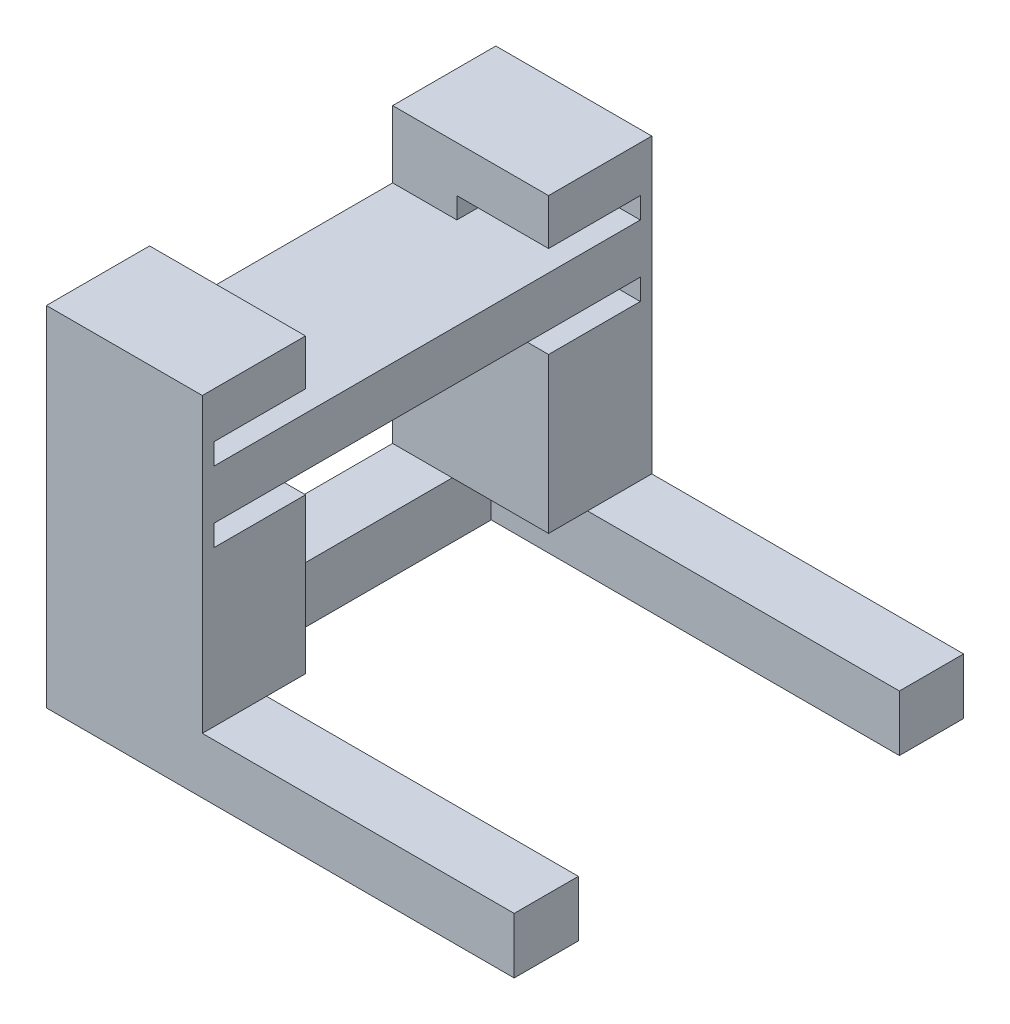
ISO-10303-21;
HEADER;
FILE_DESCRIPTION(('STEP AP214'),'2;1');
FILE_NAME('part.step','',(''),(''),'','','');
FILE_SCHEMA(('AUTOMOTIVE_DESIGN { 1 0 10303 214 1 1 1 1 }'));
ENDSEC;
DATA;
#1=APPLICATION_CONTEXT('core data for automotive mechanical design processes');
#2=APPLICATION_PROTOCOL_DEFINITION('international standard','automotive_design',2000,#1);
#3=PRODUCT_CONTEXT('',#1,'mechanical');
#4=PRODUCT('Part','Part','',(#3));
#5=PRODUCT_RELATED_PRODUCT_CATEGORY('part','',(#4));
#6=PRODUCT_DEFINITION_FORMATION('','',#4);
#7=PRODUCT_DEFINITION_CONTEXT('part definition',#1,'design');
#8=PRODUCT_DEFINITION('design','',#6,#7);
#9=PRODUCT_DEFINITION_SHAPE('','',#8);
#10=(LENGTH_UNIT() NAMED_UNIT(*) SI_UNIT(.MILLI.,.METRE.));
#11=(NAMED_UNIT(*) PLANE_ANGLE_UNIT() SI_UNIT($,.RADIAN.));
#12=(NAMED_UNIT(*) SI_UNIT($,.STERADIAN.) SOLID_ANGLE_UNIT());
#13=UNCERTAINTY_MEASURE_WITH_UNIT(LENGTH_MEASURE(1.E-05),#10,'distance_accuracy_value','');
#14=(GEOMETRIC_REPRESENTATION_CONTEXT(3) GLOBAL_UNCERTAINTY_ASSIGNED_CONTEXT((#13)) GLOBAL_UNIT_ASSIGNED_CONTEXT((#10,
#11,#12)) REPRESENTATION_CONTEXT('',''));
#15=CARTESIAN_POINT('',(0.,0.,0.));
#16=DIRECTION('',(0.,0.,1.));
#17=DIRECTION('',(1.,0.,0.));
#18=AXIS2_PLACEMENT_3D('',#15,#16,#17);
#19=CARTESIAN_POINT('',(17.,0.,0.));
#20=DIRECTION('',(1.,0.,0.));
#21=DIRECTION('',(0.,0.,-1.));
#22=AXIS2_PLACEMENT_3D('',#19,#20,#21);
#23=PLANE('',#22);
#24=DIRECTION('',(0.,0.,-1.));
#25=VECTOR('',#24,1.);
#26=CARTESIAN_POINT('',(17.,0.,0.));
#27=LINE('',#26,#25);
#28=CARTESIAN_POINT('',(17.,0.,-17.5));
#29=VERTEX_POINT('',#28);
#30=CARTESIAN_POINT('',(17.,0.,-24.5));
#31=VERTEX_POINT('',#30);
#32=EDGE_CURVE('E293',#29,#31,#27,.T.);
#33=ORIENTED_EDGE('',*,*,#32,.T.);
#34=DIRECTION('',(0.,1.,0.));
#35=VECTOR('',#34,1.);
#36=CARTESIAN_POINT('',(17.,6.1,-24.5));
#37=LINE('',#36,#35);
#38=CARTESIAN_POINT('',(17.,6.1,-24.5));
#39=VERTEX_POINT('',#38);
#40=EDGE_CURVE('E297',#31,#39,#37,.T.);
#41=ORIENTED_EDGE('',*,*,#40,.T.);
#42=DIRECTION('',(0.,0.,1.));
#43=VECTOR('',#42,1.);
#44=CARTESIAN_POINT('',(17.,6.1,0.));
#45=LINE('',#44,#43);
#46=CARTESIAN_POINT('',(17.,6.09999999999999,-17.5));
#47=VERTEX_POINT('',#46);
#48=EDGE_CURVE('E263',#39,#47,#45,.T.);
#49=ORIENTED_EDGE('',*,*,#48,.T.);
#50=DIRECTION('',(0.,-1.,0.));
#51=VECTOR('',#50,1.);
#52=CARTESIAN_POINT('',(17.,71.2920240520265,-17.5));
#53=LINE('',#52,#51);
#54=EDGE_CURVE('E257',#47,#29,#53,.T.);
#55=ORIENTED_EDGE('',*,*,#54,.T.);
#56=EDGE_LOOP('',(#33,#41,#49,#55));
#57=FACE_BOUND('',#56,.T.);
#58=ADVANCED_FACE('F32',(#57),#23,.T.);
#59=DIRECTION('',(0.,0.,1.));
#60=VECTOR('',#59,1.);
#61=CARTESIAN_POINT('',(17.,6.1,0.));
#62=LINE('',#61,#60);
#63=CARTESIAN_POINT('',(17.,6.09999999999999,17.5));
#64=VERTEX_POINT('',#63);
#65=CARTESIAN_POINT('',(17.,6.1,24.5));
#66=VERTEX_POINT('',#65);
#67=EDGE_CURVE('E254',#64,#66,#62,.T.);
#68=ORIENTED_EDGE('',*,*,#67,.T.);
#69=DIRECTION('',(0.,-1.,0.));
#70=VECTOR('',#69,1.);
#71=CARTESIAN_POINT('',(17.,6.1,24.5));
#72=LINE('',#71,#70);
#73=CARTESIAN_POINT('',(17.,0.,24.5));
#74=VERTEX_POINT('',#73);
#75=EDGE_CURVE('E299',#66,#74,#72,.T.);
#76=ORIENTED_EDGE('',*,*,#75,.T.);
#77=CARTESIAN_POINT('',(17.,0.,17.5));
#78=VERTEX_POINT('',#77);
#79=EDGE_CURVE('E256',#74,#78,#27,.T.);
#80=ORIENTED_EDGE('',*,*,#79,.T.);
#81=DIRECTION('',(0.,1.,0.));
#82=VECTOR('',#81,1.);
#83=CARTESIAN_POINT('',(17.,71.2920240520265,17.5));
#84=LINE('',#83,#82);
#85=EDGE_CURVE('E241',#78,#64,#84,.T.);
#86=ORIENTED_EDGE('',*,*,#85,.T.);
#87=EDGE_LOOP('',(#68,#76,#80,#86));
#88=FACE_BOUND('',#87,.T.);
#89=ADVANCED_FACE('F252',(#88),#23,.T.);
#90=CARTESIAN_POINT('',(-27.,0.,0.));
#91=DIRECTION('',(1.,0.,0.));
#92=DIRECTION('',(0.,0.,-1.));
#93=AXIS2_PLACEMENT_3D('',#90,#91,#92);
#94=PLANE('',#93);
#95=DIRECTION('',(0.,0.,1.));
#96=VECTOR('',#95,1.);
#97=CARTESIAN_POINT('',(-27.,30.7,0.));
#98=LINE('',#97,#96);
#99=CARTESIAN_POINT('',(-27.,30.7,13.25));
#100=VERTEX_POINT('',#99);
#101=CARTESIAN_POINT('',(-27.,30.7,23.25));
#102=VERTEX_POINT('',#101);
#103=EDGE_CURVE('E446',#100,#102,#98,.T.);
#104=ORIENTED_EDGE('',*,*,#103,.F.);
#105=DIRECTION('',(0.,1.,0.));
#106=VECTOR('',#105,1.);
#107=CARTESIAN_POINT('',(-27.,0.,13.25));
#108=LINE('',#107,#106);
#109=CARTESIAN_POINT('',(-27.,33.,13.25));
#110=VERTEX_POINT('',#109);
#111=EDGE_CURVE('E406',#100,#110,#108,.T.);
#112=ORIENTED_EDGE('',*,*,#111,.T.);
#113=DIRECTION('',(0.,0.,-1.));
#114=VECTOR('',#113,1.);
#115=CARTESIAN_POINT('',(-27.,33.,-23.25));
#116=LINE('',#115,#114);
#117=CARTESIAN_POINT('',(-27.,33.,23.25));
#118=VERTEX_POINT('',#117);
#119=EDGE_CURVE('E383',#118,#110,#116,.T.);
#120=ORIENTED_EDGE('',*,*,#119,.F.);
#121=DIRECTION('',(0.,1.,0.));
#122=VECTOR('',#121,1.);
#123=CARTESIAN_POINT('',(-27.,23.,23.25));
#124=LINE('',#123,#122);
#125=EDGE_CURVE('E379',#102,#118,#124,.T.);
#126=ORIENTED_EDGE('',*,*,#125,.F.);
#127=EDGE_LOOP('',(#104,#112,#120,#126));
#128=FACE_BOUND('',#127,.T.);
#129=ADVANCED_FACE('F571',(#128),#94,.T.);
#130=CARTESIAN_POINT('',(-27.,0.,0.));
#131=DIRECTION('',(1.,0.,0.));
#132=DIRECTION('',(0.,0.,-1.));
#133=AXIS2_PLACEMENT_3D('',#130,#131,#132);
#134=PLANE('',#133);
#135=DIRECTION('',(0.,0.,1.));
#136=VECTOR('',#135,1.);
#137=CARTESIAN_POINT('',(-27.,30.7,0.));
#138=LINE('',#137,#136);
#139=CARTESIAN_POINT('',(-27.,30.7,-23.25));
#140=VERTEX_POINT('',#139);
#141=CARTESIAN_POINT('',(-27.,30.7,-13.25));
#142=VERTEX_POINT('',#141);
#143=EDGE_CURVE('E453',#140,#142,#138,.T.);
#144=ORIENTED_EDGE('',*,*,#143,.F.);
#145=DIRECTION('',(0.,-1.,0.));
#146=VECTOR('',#145,1.);
#147=CARTESIAN_POINT('',(-27.,23.,-23.25));
#148=LINE('',#147,#146);
#149=CARTESIAN_POINT('',(-27.,33.,-23.25));
#150=VERTEX_POINT('',#149);
#151=EDGE_CURVE('E412',#150,#140,#148,.T.);
#152=ORIENTED_EDGE('',*,*,#151,.F.);
#153=DIRECTION('',(0.,0.,-1.));
#154=VECTOR('',#153,1.);
#155=CARTESIAN_POINT('',(-27.,33.,-23.25));
#156=LINE('',#155,#154);
#157=CARTESIAN_POINT('',(-27.,33.,-13.25));
#158=VERTEX_POINT('',#157);
#159=EDGE_CURVE('E414',#158,#150,#156,.T.);
#160=ORIENTED_EDGE('',*,*,#159,.F.);
#161=DIRECTION('',(0.,-1.,0.));
#162=VECTOR('',#161,1.);
#163=CARTESIAN_POINT('',(-27.,0.,-13.25));
#164=LINE('',#163,#162);
#165=EDGE_CURVE('E417',#158,#142,#164,.T.);
#166=ORIENTED_EDGE('',*,*,#165,.T.);
#167=EDGE_LOOP('',(#144,#152,#160,#166));
#168=FACE_BOUND('',#167,.T.);
#169=ADVANCED_FACE('F530',(#168),#134,.T.);
#170=DIRECTION('',(0.,0.,-1.));
#171=VECTOR('',#170,1.);
#172=CARTESIAN_POINT('',(-27.,25.3,0.));
#173=LINE('',#172,#171);
#174=CARTESIAN_POINT('',(-27.,25.3,-13.25));
#175=VERTEX_POINT('',#174);
#176=CARTESIAN_POINT('',(-27.,25.3,-23.25));
#177=VERTEX_POINT('',#176);
#178=EDGE_CURVE('E464',#175,#177,#173,.T.);
#179=ORIENTED_EDGE('',*,*,#178,.F.);
#180=CARTESIAN_POINT('',(-27.,23.,-13.25));
#181=VERTEX_POINT('',#180);
#182=EDGE_CURVE('E441',#175,#181,#164,.T.);
#183=ORIENTED_EDGE('',*,*,#182,.T.);
#184=DIRECTION('',(0.,0.,1.));
#185=VECTOR('',#184,1.);
#186=CARTESIAN_POINT('',(-27.,23.,-23.25));
#187=LINE('',#186,#185);
#188=CARTESIAN_POINT('',(-27.,23.,-23.25));
#189=VERTEX_POINT('',#188);
#190=EDGE_CURVE('E409',#189,#181,#187,.T.);
#191=ORIENTED_EDGE('',*,*,#190,.F.);
#192=EDGE_CURVE('E418',#177,#189,#148,.T.);
#193=ORIENTED_EDGE('',*,*,#192,.F.);
#194=EDGE_LOOP('',(#179,#183,#191,#193));
#195=FACE_BOUND('',#194,.T.);
#196=ADVANCED_FACE('F597',(#195),#134,.T.);
#197=DIRECTION('',(0.,0.,-1.));
#198=VECTOR('',#197,1.);
#199=CARTESIAN_POINT('',(-27.,25.3,0.));
#200=LINE('',#199,#198);
#201=CARTESIAN_POINT('',(-27.,25.3,23.25));
#202=VERTEX_POINT('',#201);
#203=CARTESIAN_POINT('',(-27.,25.3,13.25));
#204=VERTEX_POINT('',#203);
#205=EDGE_CURVE('E457',#202,#204,#200,.T.);
#206=ORIENTED_EDGE('',*,*,#205,.F.);
#207=CARTESIAN_POINT('',(-27.,23.,23.25));
#208=VERTEX_POINT('',#207);
#209=EDGE_CURVE('E395',#208,#202,#124,.T.);
#210=ORIENTED_EDGE('',*,*,#209,.F.);
#211=DIRECTION('',(0.,0.,1.));
#212=VECTOR('',#211,1.);
#213=CARTESIAN_POINT('',(-27.,23.,-23.25));
#214=LINE('',#213,#212);
#215=CARTESIAN_POINT('',(-27.,23.,13.25));
#216=VERTEX_POINT('',#215);
#217=EDGE_CURVE('E375',#216,#208,#214,.T.);
#218=ORIENTED_EDGE('',*,*,#217,.F.);
#219=EDGE_CURVE('E378',#216,#204,#108,.T.);
#220=ORIENTED_EDGE('',*,*,#219,.T.);
#221=EDGE_LOOP('',(#206,#210,#218,#220));
#222=FACE_BOUND('',#221,.T.);
#223=ADVANCED_FACE('F592',(#222),#94,.T.);
#224=CARTESIAN_POINT('',(34.001,23.,-23.25));
#225=DIRECTION('',(0.,-1.,0.));
#226=DIRECTION('',(0.,0.,-1.));
#227=AXIS2_PLACEMENT_3D('',#224,#225,#226);
#228=PLANE('',#227);
#229=DIRECTION('',(1.,0.,0.));
#230=VECTOR('',#229,1.);
#231=CARTESIAN_POINT('',(34.001,23.,13.25));
#232=LINE('',#231,#230);
#233=CARTESIAN_POINT('',(-17.,23.,13.25));
#234=VERTEX_POINT('',#233);
#235=EDGE_CURVE('E380',#216,#234,#232,.T.);
#236=ORIENTED_EDGE('',*,*,#235,.F.);
#237=ORIENTED_EDGE('',*,*,#217,.T.);
#238=DIRECTION('',(-1.,0.,0.));
#239=VECTOR('',#238,1.);
#240=CARTESIAN_POINT('',(34.001,23.,23.25));
#241=LINE('',#240,#239);
#242=CARTESIAN_POINT('',(-17.,23.,23.25));
#243=VERTEX_POINT('',#242);
#244=EDGE_CURVE('E402',#243,#208,#241,.T.);
#245=ORIENTED_EDGE('',*,*,#244,.F.);
#246=DIRECTION('',(0.,0.,1.));
#247=VECTOR('',#246,1.);
#248=CARTESIAN_POINT('',(-17.,23.,-23.25));
#249=LINE('',#248,#247);
#250=EDGE_CURVE('E384',#234,#243,#249,.T.);
#251=ORIENTED_EDGE('',*,*,#250,.F.);
#252=EDGE_LOOP('',(#236,#237,#245,#251));
#253=FACE_BOUND('',#252,.T.);
#254=ADVANCED_FACE('F587',(#253),#228,.F.);
#255=CARTESIAN_POINT('',(-34.,38.,13.25));
#256=DIRECTION('',(0.,0.,-1.));
#257=DIRECTION('',(-1.,0.,0.));
#258=AXIS2_PLACEMENT_3D('',#255,#256,#257);
#259=PLANE('',#258);
#260=DIRECTION('',(1.,0.,0.));
#261=VECTOR('',#260,1.);
#262=CARTESIAN_POINT('',(-34.,30.7,13.25));
#263=LINE('',#262,#261);
#264=CARTESIAN_POINT('',(-34.,30.7,13.25));
#265=VERTEX_POINT('',#264);
#266=EDGE_CURVE('E444',#265,#100,#263,.T.);
#267=ORIENTED_EDGE('',*,*,#266,.F.);
#268=DIRECTION('',(0.,-1.,0.));
#269=VECTOR('',#268,1.);
#270=CARTESIAN_POINT('',(-34.,38.,13.25));
#271=LINE('',#270,#269);
#272=CARTESIAN_POINT('',(-34.,38.,13.25));
#273=VERTEX_POINT('',#272);
#274=EDGE_CURVE('E324',#273,#265,#271,.T.);
#275=ORIENTED_EDGE('',*,*,#274,.F.);
#276=DIRECTION('',(1.,0.,0.));
#277=VECTOR('',#276,1.);
#278=CARTESIAN_POINT('',(-34.,38.,13.25));
#279=LINE('',#278,#277);
#280=CARTESIAN_POINT('',(-17.,38.,13.25));
#281=VERTEX_POINT('',#280);
#282=EDGE_CURVE('E340',#273,#281,#279,.T.);
#283=ORIENTED_EDGE('',*,*,#282,.T.);
#284=DIRECTION('',(0.,-1.,0.));
#285=VECTOR('',#284,1.);
#286=CARTESIAN_POINT('',(-17.,38.,13.25));
#287=LINE('',#286,#285);
#288=CARTESIAN_POINT('',(-17.,33.,13.25));
#289=VERTEX_POINT('',#288);
#290=EDGE_CURVE('E329',#281,#289,#287,.T.);
#291=ORIENTED_EDGE('',*,*,#290,.T.);
#292=DIRECTION('',(-1.,0.,0.));
#293=VECTOR('',#292,1.);
#294=CARTESIAN_POINT('',(34.001,33.,13.25));
#295=LINE('',#294,#293);
#296=EDGE_CURVE('E374',#289,#110,#295,.T.);
#297=ORIENTED_EDGE('',*,*,#296,.T.);
#298=ORIENTED_EDGE('',*,*,#111,.F.);
#299=EDGE_LOOP('',(#267,#275,#283,#291,#297,#298));
#300=FACE_BOUND('',#299,.T.);
#301=ADVANCED_FACE('F566',(#300),#259,.T.);
#302=CARTESIAN_POINT('',(34.001,33.,-23.25));
#303=DIRECTION('',(0.,1.,0.));
#304=DIRECTION('',(0.,0.,1.));
#305=AXIS2_PLACEMENT_3D('',#302,#303,#304);
#306=PLANE('',#305);
#307=DIRECTION('',(-1.,0.,0.));
#308=VECTOR('',#307,1.);
#309=CARTESIAN_POINT('',(34.001,33.,23.25));
#310=LINE('',#309,#308);
#311=CARTESIAN_POINT('',(-17.,33.,23.25));
#312=VERTEX_POINT('',#311);
#313=EDGE_CURVE('E392',#312,#118,#310,.T.);
#314=ORIENTED_EDGE('',*,*,#313,.T.);
#315=ORIENTED_EDGE('',*,*,#119,.T.);
#316=ORIENTED_EDGE('',*,*,#296,.F.);
#317=DIRECTION('',(0.,0.,-1.));
#318=VECTOR('',#317,1.);
#319=CARTESIAN_POINT('',(-17.,33.,-23.25));
#320=LINE('',#319,#318);
#321=EDGE_CURVE('E387',#312,#289,#320,.T.);
#322=ORIENTED_EDGE('',*,*,#321,.F.);
#323=EDGE_LOOP('',(#314,#315,#316,#322));
#324=FACE_BOUND('',#323,.T.);
#325=ADVANCED_FACE('F578',(#324),#306,.F.);
#326=CARTESIAN_POINT('',(34.001,23.,23.25));
#327=DIRECTION('',(0.,0.,1.));
#328=DIRECTION('',(1.,0.,0.));
#329=AXIS2_PLACEMENT_3D('',#326,#327,#328);
#330=PLANE('',#329);
#331=DIRECTION('',(0.,1.,0.));
#332=VECTOR('',#331,1.);
#333=CARTESIAN_POINT('',(-17.,23.,23.25));
#334=LINE('',#333,#332);
#335=CARTESIAN_POINT('',(-17.,30.7,23.25));
#336=VERTEX_POINT('',#335);
#337=EDGE_CURVE('E391',#336,#312,#334,.T.);
#338=ORIENTED_EDGE('',*,*,#337,.F.);
#339=DIRECTION('',(-1.,0.,0.));
#340=VECTOR('',#339,1.);
#341=CARTESIAN_POINT('',(34.001,30.7,23.25));
#342=LINE('',#341,#340);
#343=EDGE_CURVE('E448',#336,#102,#342,.T.);
#344=ORIENTED_EDGE('',*,*,#343,.T.);
#345=ORIENTED_EDGE('',*,*,#125,.T.);
#346=ORIENTED_EDGE('',*,*,#313,.F.);
#347=EDGE_LOOP('',(#338,#344,#345,#346));
#348=FACE_BOUND('',#347,.T.);
#349=ADVANCED_FACE('F575',(#348),#330,.F.);
#350=CARTESIAN_POINT('',(32.2966530304036,30.7,24.5));
#351=DIRECTION('',(0.,1.,0.));
#352=DIRECTION('',(0.,0.,1.));
#353=AXIS2_PLACEMENT_3D('',#350,#351,#352);
#354=PLANE('',#353);
#355=DIRECTION('',(0.,0.,-1.));
#356=VECTOR('',#355,1.);
#357=CARTESIAN_POINT('',(-34.,30.7,24.5));
#358=LINE('',#357,#356);
#359=CARTESIAN_POINT('',(-34.,30.7,-13.25));
#360=VERTEX_POINT('',#359);
#361=EDGE_CURVE('E471',#265,#360,#358,.T.);
#362=ORIENTED_EDGE('',*,*,#361,.F.);
#363=ORIENTED_EDGE('',*,*,#266,.T.);
#364=ORIENTED_EDGE('',*,*,#103,.T.);
#365=ORIENTED_EDGE('',*,*,#343,.F.);
#366=DIRECTION('',(0.,0.,-1.));
#367=VECTOR('',#366,1.);
#368=CARTESIAN_POINT('',(-17.,30.7,24.5));
#369=LINE('',#368,#367);
#370=CARTESIAN_POINT('',(-17.,30.7,-23.25));
#371=VERTEX_POINT('',#370);
#372=EDGE_CURVE('E468',#336,#371,#369,.T.);
#373=ORIENTED_EDGE('',*,*,#372,.T.);
#374=DIRECTION('',(1.,0.,0.));
#375=VECTOR('',#374,1.);
#376=CARTESIAN_POINT('',(34.001,30.7,-23.25));
#377=LINE('',#376,#375);
#378=EDGE_CURVE('E301',#140,#371,#377,.T.);
#379=ORIENTED_EDGE('',*,*,#378,.F.);
#380=ORIENTED_EDGE('',*,*,#143,.T.);
#381=DIRECTION('',(-1.,0.,0.));
#382=VECTOR('',#381,1.);
#383=CARTESIAN_POINT('',(-34.,30.7,-13.25));
#384=LINE('',#383,#382);
#385=EDGE_CURVE('E451',#142,#360,#384,.T.);
#386=ORIENTED_EDGE('',*,*,#385,.T.);
#387=EDGE_LOOP('',(#362,#363,#364,#365,#373,#379,#380,#386));
#388=FACE_BOUND('',#387,.T.);
#389=ADVANCED_FACE('F531',(#388),#354,.T.);
#390=CARTESIAN_POINT('',(34.001,23.,-23.25));
#391=DIRECTION('',(0.,0.,-1.));
#392=DIRECTION('',(-1.,0.,0.));
#393=AXIS2_PLACEMENT_3D('',#390,#391,#392);
#394=PLANE('',#393);
#395=ORIENTED_EDGE('',*,*,#151,.T.);
#396=ORIENTED_EDGE('',*,*,#378,.T.);
#397=DIRECTION('',(0.,-1.,0.));
#398=VECTOR('',#397,1.);
#399=CARTESIAN_POINT('',(-17.,23.,-23.25));
#400=LINE('',#399,#398);
#401=CARTESIAN_POINT('',(-17.,33.,-23.25));
#402=VERTEX_POINT('',#401);
#403=EDGE_CURVE('E422',#402,#371,#400,.T.);
#404=ORIENTED_EDGE('',*,*,#403,.F.);
#405=DIRECTION('',(-1.,0.,0.));
#406=VECTOR('',#405,1.);
#407=CARTESIAN_POINT('',(34.001,33.,-23.25));
#408=LINE('',#407,#406);
#409=EDGE_CURVE('E423',#402,#150,#408,.T.);
#410=ORIENTED_EDGE('',*,*,#409,.T.);
#411=EDGE_LOOP('',(#395,#396,#404,#410));
#412=FACE_BOUND('',#411,.T.);
#413=ADVANCED_FACE('F514',(#412),#394,.F.);
#414=CARTESIAN_POINT('',(34.001,33.,-23.25));
#415=DIRECTION('',(0.,1.,0.));
#416=DIRECTION('',(0.,0.,1.));
#417=AXIS2_PLACEMENT_3D('',#414,#415,#416);
#418=PLANE('',#417);
#419=ORIENTED_EDGE('',*,*,#159,.T.);
#420=ORIENTED_EDGE('',*,*,#409,.F.);
#421=DIRECTION('',(0.,0.,-1.));
#422=VECTOR('',#421,1.);
#423=CARTESIAN_POINT('',(-17.,33.,-23.25));
#424=LINE('',#423,#422);
#425=CARTESIAN_POINT('',(-17.,33.,-13.25));
#426=VERTEX_POINT('',#425);
#427=EDGE_CURVE('E425',#426,#402,#424,.T.);
#428=ORIENTED_EDGE('',*,*,#427,.F.);
#429=DIRECTION('',(1.,0.,0.));
#430=VECTOR('',#429,1.);
#431=CARTESIAN_POINT('',(34.001,33.,-13.25));
#432=LINE('',#431,#430);
#433=EDGE_CURVE('E430',#158,#426,#432,.T.);
#434=ORIENTED_EDGE('',*,*,#433,.F.);
#435=EDGE_LOOP('',(#419,#420,#428,#434));
#436=FACE_BOUND('',#435,.T.);
#437=ADVANCED_FACE('F524',(#436),#418,.F.);
#438=CARTESIAN_POINT('',(-34.,38.,-13.25));
#439=DIRECTION('',(0.,0.,1.));
#440=DIRECTION('',(1.,0.,0.));
#441=AXIS2_PLACEMENT_3D('',#438,#439,#440);
#442=PLANE('',#441);
#443=ORIENTED_EDGE('',*,*,#385,.F.);
#444=ORIENTED_EDGE('',*,*,#165,.F.);
#445=ORIENTED_EDGE('',*,*,#433,.T.);
#446=DIRECTION('',(0.,-1.,0.));
#447=VECTOR('',#446,1.);
#448=CARTESIAN_POINT('',(-17.,38.,-13.25));
#449=LINE('',#448,#447);
#450=CARTESIAN_POINT('',(-17.,38.,-13.25));
#451=VERTEX_POINT('',#450);
#452=EDGE_CURVE('E356',#451,#426,#449,.T.);
#453=ORIENTED_EDGE('',*,*,#452,.F.);
#454=DIRECTION('',(-1.,0.,0.));
#455=VECTOR('',#454,1.);
#456=CARTESIAN_POINT('',(-34.,38.,-13.25));
#457=LINE('',#456,#455);
#458=CARTESIAN_POINT('',(-34.,38.,-13.25));
#459=VERTEX_POINT('',#458);
#460=EDGE_CURVE('E354',#451,#459,#457,.T.);
#461=ORIENTED_EDGE('',*,*,#460,.T.);
#462=DIRECTION('',(0.,-1.,0.));
#463=VECTOR('',#462,1.);
#464=CARTESIAN_POINT('',(-34.,38.,-13.25));
#465=LINE('',#464,#463);
#466=EDGE_CURVE('E360',#459,#360,#465,.T.);
#467=ORIENTED_EDGE('',*,*,#466,.T.);
#468=EDGE_LOOP('',(#443,#444,#445,#453,#461,#467));
#469=FACE_BOUND('',#468,.T.);
#470=ADVANCED_FACE('F528',(#469),#442,.T.);
#471=CARTESIAN_POINT('',(34.001,23.,-23.25));
#472=DIRECTION('',(0.,-1.,0.));
#473=DIRECTION('',(0.,0.,-1.));
#474=AXIS2_PLACEMENT_3D('',#471,#472,#473);
#475=PLANE('',#474);
#476=DIRECTION('',(0.,0.,1.));
#477=VECTOR('',#476,1.);
#478=CARTESIAN_POINT('',(-17.,23.,-23.25));
#479=LINE('',#478,#477);
#480=CARTESIAN_POINT('',(-17.,23.,-23.25));
#481=VERTEX_POINT('',#480);
#482=CARTESIAN_POINT('',(-17.,23.,-13.25));
#483=VERTEX_POINT('',#482);
#484=EDGE_CURVE('E413',#481,#483,#479,.T.);
#485=ORIENTED_EDGE('',*,*,#484,.F.);
#486=DIRECTION('',(-1.,0.,0.));
#487=VECTOR('',#486,1.);
#488=CARTESIAN_POINT('',(34.001,23.,-23.25));
#489=LINE('',#488,#487);
#490=EDGE_CURVE('E419',#481,#189,#489,.T.);
#491=ORIENTED_EDGE('',*,*,#490,.T.);
#492=ORIENTED_EDGE('',*,*,#190,.T.);
#493=DIRECTION('',(-1.,0.,0.));
#494=VECTOR('',#493,1.);
#495=CARTESIAN_POINT('',(34.001,23.,-13.25));
#496=LINE('',#495,#494);
#497=EDGE_CURVE('E427',#483,#181,#496,.T.);
#498=ORIENTED_EDGE('',*,*,#497,.F.);
#499=EDGE_LOOP('',(#485,#491,#492,#498));
#500=FACE_BOUND('',#499,.T.);
#501=ADVANCED_FACE('F624',(#500),#475,.F.);
#502=CARTESIAN_POINT('',(-17.,25.3,-23.25));
#503=VERTEX_POINT('',#502);
#504=EDGE_CURVE('E426',#503,#481,#400,.T.);
#505=ORIENTED_EDGE('',*,*,#504,.F.);
#506=DIRECTION('',(-1.,0.,0.));
#507=VECTOR('',#506,1.);
#508=CARTESIAN_POINT('',(34.001,25.3,-23.25));
#509=LINE('',#508,#507);
#510=EDGE_CURVE('E506',#503,#177,#509,.T.);
#511=ORIENTED_EDGE('',*,*,#510,.T.);
#512=ORIENTED_EDGE('',*,*,#192,.T.);
#513=ORIENTED_EDGE('',*,*,#490,.F.);
#514=EDGE_LOOP('',(#505,#511,#512,#513));
#515=FACE_BOUND('',#514,.T.);
#516=ADVANCED_FACE('F620',(#515),#394,.F.);
#517=CARTESIAN_POINT('',(32.2966530304036,25.3,24.5));
#518=DIRECTION('',(0.,-1.,0.));
#519=DIRECTION('',(0.,0.,-1.));
#520=AXIS2_PLACEMENT_3D('',#517,#518,#519);
#521=PLANE('',#520);
#522=ORIENTED_EDGE('',*,*,#205,.T.);
#523=DIRECTION('',(-1.,0.,0.));
#524=VECTOR('',#523,1.);
#525=CARTESIAN_POINT('',(-34.,25.3,13.25));
#526=LINE('',#525,#524);
#527=CARTESIAN_POINT('',(-34.,25.3,13.25));
#528=VERTEX_POINT('',#527);
#529=EDGE_CURVE('E455',#204,#528,#526,.T.);
#530=ORIENTED_EDGE('',*,*,#529,.T.);
#531=DIRECTION('',(0.,0.,1.));
#532=VECTOR('',#531,1.);
#533=CARTESIAN_POINT('',(-34.,25.3,24.5));
#534=LINE('',#533,#532);
#535=CARTESIAN_POINT('',(-34.,25.3,-13.25));
#536=VERTEX_POINT('',#535);
#537=EDGE_CURVE('E470',#536,#528,#534,.T.);
#538=ORIENTED_EDGE('',*,*,#537,.F.);
#539=DIRECTION('',(1.,0.,0.));
#540=VECTOR('',#539,1.);
#541=CARTESIAN_POINT('',(-34.,25.3,-13.25));
#542=LINE('',#541,#540);
#543=EDGE_CURVE('E462',#536,#175,#542,.T.);
#544=ORIENTED_EDGE('',*,*,#543,.T.);
#545=ORIENTED_EDGE('',*,*,#178,.T.);
#546=ORIENTED_EDGE('',*,*,#510,.F.);
#547=DIRECTION('',(0.,0.,1.));
#548=VECTOR('',#547,1.);
#549=CARTESIAN_POINT('',(-17.,25.3,24.5));
#550=LINE('',#549,#548);
#551=CARTESIAN_POINT('',(-17.,25.3,23.25));
#552=VERTEX_POINT('',#551);
#553=EDGE_CURVE('E466',#503,#552,#550,.T.);
#554=ORIENTED_EDGE('',*,*,#553,.T.);
#555=DIRECTION('',(1.,0.,0.));
#556=VECTOR('',#555,1.);
#557=CARTESIAN_POINT('',(34.001,25.3,23.25));
#558=LINE('',#557,#556);
#559=EDGE_CURVE('E459',#202,#552,#558,.T.);
#560=ORIENTED_EDGE('',*,*,#559,.F.);
#561=EDGE_LOOP('',(#522,#530,#538,#544,#545,#546,#554,#560));
#562=FACE_BOUND('',#561,.T.);
#563=ADVANCED_FACE('F627',(#562),#521,.T.);
#564=ORIENTED_EDGE('',*,*,#209,.T.);
#565=ORIENTED_EDGE('',*,*,#559,.T.);
#566=EDGE_CURVE('E388',#243,#552,#334,.T.);
#567=ORIENTED_EDGE('',*,*,#566,.F.);
#568=ORIENTED_EDGE('',*,*,#244,.T.);
#569=EDGE_LOOP('',(#564,#565,#567,#568));
#570=FACE_BOUND('',#569,.T.);
#571=ADVANCED_FACE('F586',(#570),#330,.F.);
#572=ORIENTED_EDGE('',*,*,#543,.F.);
#573=CARTESIAN_POINT('',(-34.,6.1,-13.25));
#574=VERTEX_POINT('',#573);
#575=EDGE_CURVE('E359',#536,#574,#465,.T.);
#576=ORIENTED_EDGE('',*,*,#575,.T.);
#577=DIRECTION('',(1.,0.,0.));
#578=VECTOR('',#577,1.);
#579=CARTESIAN_POINT('',(0.,6.1,-13.25));
#580=LINE('',#579,#578);
#581=CARTESIAN_POINT('',(-27.5,6.09999999999999,-13.25));
#582=VERTEX_POINT('',#581);
#583=EDGE_CURVE('E346',#574,#582,#580,.T.);
#584=ORIENTED_EDGE('',*,*,#583,.T.);
#585=DIRECTION('',(-1.,0.,0.));
#586=VECTOR('',#585,1.);
#587=CARTESIAN_POINT('',(-34.,6.1,-13.25));
#588=LINE('',#587,#586);
#589=CARTESIAN_POINT('',(-17.,6.1,-13.25));
#590=VERTEX_POINT('',#589);
#591=EDGE_CURVE('E478',#590,#582,#588,.T.);
#592=ORIENTED_EDGE('',*,*,#591,.F.);
#593=EDGE_CURVE('E355',#483,#590,#449,.T.);
#594=ORIENTED_EDGE('',*,*,#593,.F.);
#595=ORIENTED_EDGE('',*,*,#497,.T.);
#596=ORIENTED_EDGE('',*,*,#182,.F.);
#597=EDGE_LOOP('',(#572,#576,#584,#592,#594,#595,#596));
#598=FACE_BOUND('',#597,.T.);
#599=ADVANCED_FACE('F544',(#598),#442,.T.);
#600=ORIENTED_EDGE('',*,*,#529,.F.);
#601=ORIENTED_EDGE('',*,*,#219,.F.);
#602=ORIENTED_EDGE('',*,*,#235,.T.);
#603=CARTESIAN_POINT('',(-17.,6.1,13.25));
#604=VERTEX_POINT('',#603);
#605=EDGE_CURVE('E328',#234,#604,#287,.T.);
#606=ORIENTED_EDGE('',*,*,#605,.T.);
#607=DIRECTION('',(-1.,0.,0.));
#608=VECTOR('',#607,1.);
#609=CARTESIAN_POINT('',(0.,6.1,13.25));
#610=LINE('',#609,#608);
#611=CARTESIAN_POINT('',(-27.5,6.09999999999999,13.25));
#612=VERTEX_POINT('',#611);
#613=EDGE_CURVE('E320',#604,#612,#610,.T.);
#614=ORIENTED_EDGE('',*,*,#613,.T.);
#615=CARTESIAN_POINT('',(-34.,6.1,13.25));
#616=VERTEX_POINT('',#615);
#617=EDGE_CURVE('E323',#612,#616,#610,.T.);
#618=ORIENTED_EDGE('',*,*,#617,.T.);
#619=EDGE_CURVE('E327',#528,#616,#271,.T.);
#620=ORIENTED_EDGE('',*,*,#619,.F.);
#621=EDGE_LOOP('',(#600,#601,#602,#606,#614,#618,#620));
#622=FACE_BOUND('',#621,.T.);
#623=ADVANCED_FACE('F552',(#622),#259,.T.);
#624=CARTESIAN_POINT('',(0.,6.1,0.));
#625=DIRECTION('',(0.,1.,0.));
#626=DIRECTION('',(0.,0.,1.));
#627=AXIS2_PLACEMENT_3D('',#624,#625,#626);
#628=PLANE('',#627);
#629=DIRECTION('',(0.,0.,-1.));
#630=VECTOR('',#629,1.);
#631=CARTESIAN_POINT('',(-27.5,6.09999999999999,-17.5));
#632=LINE('',#631,#630);
#633=EDGE_CURVE('E485',#612,#582,#632,.T.);
#634=ORIENTED_EDGE('',*,*,#633,.T.);
#635=ORIENTED_EDGE('',*,*,#583,.F.);
#636=DIRECTION('',(0.,0.,1.));
#637=VECTOR('',#636,1.);
#638=CARTESIAN_POINT('',(-34.,6.1,24.5));
#639=LINE('',#638,#637);
#640=EDGE_CURVE('E305',#574,#616,#639,.T.);
#641=ORIENTED_EDGE('',*,*,#640,.T.);
#642=ORIENTED_EDGE('',*,*,#617,.F.);
#643=EDGE_LOOP('',(#634,#635,#641,#642));
#644=FACE_BOUND('',#643,.T.);
#645=ADVANCED_FACE('F546',(#644),#628,.T.);
#646=CARTESIAN_POINT('',(0.,38.,0.));
#647=DIRECTION('',(0.,-1.,0.));
#648=DIRECTION('',(0.,0.,-1.));
#649=AXIS2_PLACEMENT_3D('',#646,#647,#648);
#650=PLANE('',#649);
#651=DIRECTION('',(0.,0.,-1.));
#652=VECTOR('',#651,1.);
#653=CARTESIAN_POINT('',(-34.,38.,24.5));
#654=LINE('',#653,#652);
#655=CARTESIAN_POINT('',(-34.,38.,24.5));
#656=VERTEX_POINT('',#655);
#657=EDGE_CURVE('E343',#656,#273,#654,.T.);
#658=ORIENTED_EDGE('',*,*,#657,.F.);
#659=DIRECTION('',(-1.,0.,0.));
#660=VECTOR('',#659,1.);
#661=CARTESIAN_POINT('',(-34.,38.,24.5));
#662=LINE('',#661,#660);
#663=CARTESIAN_POINT('',(-17.,38.,24.5));
#664=VERTEX_POINT('',#663);
#665=EDGE_CURVE('E334',#664,#656,#662,.T.);
#666=ORIENTED_EDGE('',*,*,#665,.F.);
#667=DIRECTION('',(0.,0.,1.));
#668=VECTOR('',#667,1.);
#669=CARTESIAN_POINT('',(-17.,38.,24.5));
#670=LINE('',#669,#668);
#671=EDGE_CURVE('E337',#281,#664,#670,.T.);
#672=ORIENTED_EDGE('',*,*,#671,.F.);
#673=ORIENTED_EDGE('',*,*,#282,.F.);
#674=EDGE_LOOP('',(#658,#666,#672,#673));
#675=FACE_BOUND('',#674,.T.);
#676=ADVANCED_FACE('F564',(#675),#650,.F.);
#677=CARTESIAN_POINT('',(0.,38.,0.));
#678=DIRECTION('',(0.,1.,0.));
#679=DIRECTION('',(0.,0.,1.));
#680=AXIS2_PLACEMENT_3D('',#677,#678,#679);
#681=PLANE('',#680);
#682=DIRECTION('',(0.,0.,-1.));
#683=VECTOR('',#682,1.);
#684=CARTESIAN_POINT('',(-34.,38.,-24.5));
#685=LINE('',#684,#683);
#686=CARTESIAN_POINT('',(-34.,38.,-24.5));
#687=VERTEX_POINT('',#686);
#688=EDGE_CURVE('E371',#459,#687,#685,.T.);
#689=ORIENTED_EDGE('',*,*,#688,.F.);
#690=ORIENTED_EDGE('',*,*,#460,.F.);
#691=DIRECTION('',(0.,0.,1.));
#692=VECTOR('',#691,1.);
#693=CARTESIAN_POINT('',(-17.,38.,-24.5));
#694=LINE('',#693,#692);
#695=CARTESIAN_POINT('',(-17.,38.,-24.5));
#696=VERTEX_POINT('',#695);
#697=EDGE_CURVE('E365',#696,#451,#694,.T.);
#698=ORIENTED_EDGE('',*,*,#697,.F.);
#699=DIRECTION('',(1.,0.,0.));
#700=VECTOR('',#699,1.);
#701=CARTESIAN_POINT('',(-34.,38.,-24.5));
#702=LINE('',#701,#700);
#703=EDGE_CURVE('E368',#687,#696,#702,.T.);
#704=ORIENTED_EDGE('',*,*,#703,.F.);
#705=EDGE_LOOP('',(#689,#690,#698,#704));
#706=FACE_BOUND('',#705,.T.);
#707=ADVANCED_FACE('F538',(#706),#681,.T.);
#708=CARTESIAN_POINT('',(-34.,6.1,24.5));
#709=DIRECTION('',(1.,0.,0.));
#710=DIRECTION('',(0.,0.,-1.));
#711=AXIS2_PLACEMENT_3D('',#708,#709,#710);
#712=PLANE('',#711);
#713=ORIENTED_EDGE('',*,*,#537,.T.);
#714=ORIENTED_EDGE('',*,*,#619,.T.);
#715=ORIENTED_EDGE('',*,*,#640,.F.);
#716=ORIENTED_EDGE('',*,*,#575,.F.);
#717=EDGE_LOOP('',(#713,#714,#715,#716));
#718=FACE_BOUND('',#717,.T.);
#719=DIRECTION('',(0.,0.,1.));
#720=VECTOR('',#719,1.);
#721=CARTESIAN_POINT('',(-34.,0.,24.5));
#722=LINE('',#721,#720);
#723=CARTESIAN_POINT('',(-34.,0.,-24.5));
#724=VERTEX_POINT('',#723);
#725=CARTESIAN_POINT('',(-34.,0.,24.5));
#726=VERTEX_POINT('',#725);
#727=EDGE_CURVE('E307',#724,#726,#722,.T.);
#728=ORIENTED_EDGE('',*,*,#727,.T.);
#729=DIRECTION('',(0.,-1.,0.));
#730=VECTOR('',#729,1.);
#731=CARTESIAN_POINT('',(-34.,6.1,24.5));
#732=LINE('',#731,#730);
#733=EDGE_CURVE('E505',#656,#726,#732,.T.);
#734=ORIENTED_EDGE('',*,*,#733,.F.);
#735=ORIENTED_EDGE('',*,*,#657,.T.);
#736=ORIENTED_EDGE('',*,*,#274,.T.);
#737=ORIENTED_EDGE('',*,*,#361,.T.);
#738=ORIENTED_EDGE('',*,*,#466,.F.);
#739=ORIENTED_EDGE('',*,*,#688,.T.);
#740=DIRECTION('',(0.,-1.,0.));
#741=VECTOR('',#740,1.);
#742=CARTESIAN_POINT('',(-34.,6.1,-24.5));
#743=LINE('',#742,#741);
#744=EDGE_CURVE('E503',#687,#724,#743,.T.);
#745=ORIENTED_EDGE('',*,*,#744,.T.);
#746=EDGE_LOOP('',(#728,#734,#735,#736,#737,#738,#739,#745));
#747=FACE_BOUND('',#746,.T.);
#748=ADVANCED_FACE('F533',(#718,#747),#712,.F.);
#749=CARTESIAN_POINT('',(34.,6.1,24.5));
#750=DIRECTION('',(0.,0.,-1.));
#751=DIRECTION('',(-1.,0.,0.));
#752=AXIS2_PLACEMENT_3D('',#749,#750,#751);
#753=PLANE('',#752);
#754=ORIENTED_EDGE('',*,*,#75,.F.);
#755=DIRECTION('',(1.,0.,0.));
#756=VECTOR('',#755,1.);
#757=CARTESIAN_POINT('',(34.,6.1,24.5));
#758=LINE('',#757,#756);
#759=CARTESIAN_POINT('',(-17.,6.1,24.5));
#760=VERTEX_POINT('',#759);
#761=EDGE_CURVE('E261',#760,#66,#758,.T.);
#762=ORIENTED_EDGE('',*,*,#761,.F.);
#763=DIRECTION('',(0.,-1.,0.));
#764=VECTOR('',#763,1.);
#765=CARTESIAN_POINT('',(-17.,38.,24.5));
#766=LINE('',#765,#764);
#767=EDGE_CURVE('E332',#664,#760,#766,.T.);
#768=ORIENTED_EDGE('',*,*,#767,.F.);
#769=ORIENTED_EDGE('',*,*,#665,.T.);
#770=ORIENTED_EDGE('',*,*,#733,.T.);
#771=DIRECTION('',(1.,0.,0.));
#772=VECTOR('',#771,1.);
#773=CARTESIAN_POINT('',(34.,0.,24.5));
#774=LINE('',#773,#772);
#775=EDGE_CURVE('E268',#726,#74,#774,.T.);
#776=ORIENTED_EDGE('',*,*,#775,.T.);
#777=EDGE_LOOP('',(#754,#762,#768,#769,#770,#776));
#778=FACE_BOUND('',#777,.T.);
#779=ADVANCED_FACE('F558',(#778),#753,.F.);
#780=CARTESIAN_POINT('',(-17.,38.,24.5));
#781=DIRECTION('',(1.,0.,0.));
#782=DIRECTION('',(0.,0.,-1.));
#783=AXIS2_PLACEMENT_3D('',#780,#781,#782);
#784=PLANE('',#783);
#785=ORIENTED_EDGE('',*,*,#566,.T.);
#786=ORIENTED_EDGE('',*,*,#553,.F.);
#787=ORIENTED_EDGE('',*,*,#504,.T.);
#788=ORIENTED_EDGE('',*,*,#484,.T.);
#789=ORIENTED_EDGE('',*,*,#593,.T.);
#790=DIRECTION('',(0.,0.,-1.));
#791=VECTOR('',#790,1.);
#792=CARTESIAN_POINT('',(-17.,6.1,0.));
#793=LINE('',#792,#791);
#794=CARTESIAN_POINT('',(-17.,6.09999999999999,-17.5));
#795=VERTEX_POINT('',#794);
#796=EDGE_CURVE('E349',#590,#795,#793,.T.);
#797=ORIENTED_EDGE('',*,*,#796,.T.);
#798=CARTESIAN_POINT('',(-17.,6.1,-24.5));
#799=VERTEX_POINT('',#798);
#800=EDGE_CURVE('E282',#795,#799,#793,.T.);
#801=ORIENTED_EDGE('',*,*,#800,.T.);
#802=DIRECTION('',(0.,-1.,0.));
#803=VECTOR('',#802,1.);
#804=CARTESIAN_POINT('',(-17.,38.,-24.5));
#805=LINE('',#804,#803);
#806=EDGE_CURVE('E351',#696,#799,#805,.T.);
#807=ORIENTED_EDGE('',*,*,#806,.F.);
#808=ORIENTED_EDGE('',*,*,#697,.T.);
#809=ORIENTED_EDGE('',*,*,#452,.T.);
#810=ORIENTED_EDGE('',*,*,#427,.T.);
#811=ORIENTED_EDGE('',*,*,#403,.T.);
#812=ORIENTED_EDGE('',*,*,#372,.F.);
#813=ORIENTED_EDGE('',*,*,#337,.T.);
#814=ORIENTED_EDGE('',*,*,#321,.T.);
#815=ORIENTED_EDGE('',*,*,#290,.F.);
#816=ORIENTED_EDGE('',*,*,#671,.T.);
#817=ORIENTED_EDGE('',*,*,#767,.T.);
#818=DIRECTION('',(0.,0.,-1.));
#819=VECTOR('',#818,1.);
#820=CARTESIAN_POINT('',(-17.,6.1,0.));
#821=LINE('',#820,#819);
#822=CARTESIAN_POINT('',(-17.,6.09999999999999,17.5));
#823=VERTEX_POINT('',#822);
#824=EDGE_CURVE('E318',#760,#823,#821,.T.);
#825=ORIENTED_EDGE('',*,*,#824,.T.);
#826=DIRECTION('',(0.,0.,1.));
#827=VECTOR('',#826,1.);
#828=CARTESIAN_POINT('',(-17.,6.1,24.5));
#829=LINE('',#828,#827);
#830=EDGE_CURVE('E474',#604,#823,#829,.T.);
#831=ORIENTED_EDGE('',*,*,#830,.F.);
#832=ORIENTED_EDGE('',*,*,#605,.F.);
#833=ORIENTED_EDGE('',*,*,#250,.T.);
#834=EDGE_LOOP('',(#785,#786,#787,#788,#789,#797,#801,#807,#808,#809,#810,#811,#812,#813,#814,
#815,#816,#817,#825,#831,#832,#833));
#835=FACE_BOUND('',#834,.T.);
#836=ADVANCED_FACE('F520',(#835),#784,.T.);
#837=CARTESIAN_POINT('',(34.,6.1,-24.5));
#838=DIRECTION('',(0.,0.,1.));
#839=DIRECTION('',(1.,0.,0.));
#840=AXIS2_PLACEMENT_3D('',#837,#838,#839);
#841=PLANE('',#840);
#842=ORIENTED_EDGE('',*,*,#40,.F.);
#843=DIRECTION('',(-1.,0.,0.));
#844=VECTOR('',#843,1.);
#845=CARTESIAN_POINT('',(34.,0.,-24.5));
#846=LINE('',#845,#844);
#847=EDGE_CURVE('E304',#31,#724,#846,.T.);
#848=ORIENTED_EDGE('',*,*,#847,.T.);
#849=ORIENTED_EDGE('',*,*,#744,.F.);
#850=ORIENTED_EDGE('',*,*,#703,.T.);
#851=ORIENTED_EDGE('',*,*,#806,.T.);
#852=DIRECTION('',(-1.,0.,0.));
#853=VECTOR('',#852,1.);
#854=CARTESIAN_POINT('',(34.,6.1,-24.5));
#855=LINE('',#854,#853);
#856=EDGE_CURVE('E314',#39,#799,#855,.T.);
#857=ORIENTED_EDGE('',*,*,#856,.F.);
#858=EDGE_LOOP('',(#842,#848,#849,#850,#851,#857));
#859=FACE_BOUND('',#858,.T.);
#860=ADVANCED_FACE('F34',(#859),#841,.F.);
#861=DIRECTION('',(-1.,0.,0.));
#862=VECTOR('',#861,1.);
#863=CARTESIAN_POINT('',(27.5,6.09999999999999,17.5));
#864=LINE('',#863,#862);
#865=EDGE_CURVE('E238',#64,#823,#864,.T.);
#866=ORIENTED_EDGE('',*,*,#865,.T.);
#867=ORIENTED_EDGE('',*,*,#824,.F.);
#868=ORIENTED_EDGE('',*,*,#761,.T.);
#869=ORIENTED_EDGE('',*,*,#67,.F.);
#870=EDGE_LOOP('',(#866,#867,#868,#869));
#871=FACE_BOUND('',#870,.T.);
#872=ADVANCED_FACE('F259',(#871),#628,.T.);
#873=CARTESIAN_POINT('',(0.,6.1,0.));
#874=DIRECTION('',(0.,1.,0.));
#875=DIRECTION('',(0.,0.,1.));
#876=AXIS2_PLACEMENT_3D('',#873,#874,#875);
#877=PLANE('',#876);
#878=ORIENTED_EDGE('',*,*,#830,.T.);
#879=CARTESIAN_POINT('',(-27.5,6.09999999999999,17.5));
#880=VERTEX_POINT('',#879);
#881=EDGE_CURVE('E49',#823,#880,#864,.T.);
#882=ORIENTED_EDGE('',*,*,#881,.T.);
#883=EDGE_CURVE('E482',#880,#612,#632,.T.);
#884=ORIENTED_EDGE('',*,*,#883,.T.);
#885=ORIENTED_EDGE('',*,*,#613,.F.);
#886=EDGE_LOOP('',(#878,#882,#884,#885));
#887=FACE_BOUND('',#886,.T.);
#888=ADVANCED_FACE('F557',(#887),#877,.F.);
#889=CARTESIAN_POINT('',(-27.5,71.2920240520265,-17.5));
#890=DIRECTION('',(-1.,0.,0.));
#891=DIRECTION('',(0.,0.,1.));
#892=AXIS2_PLACEMENT_3D('',#889,#890,#891);
#893=PLANE('',#892);
#894=DIRECTION('',(0.,-1.,0.));
#895=VECTOR('',#894,1.);
#896=CARTESIAN_POINT('',(-27.5,71.2920240520265,17.5));
#897=LINE('',#896,#895);
#898=CARTESIAN_POINT('',(-27.5,0.,17.5));
#899=VERTEX_POINT('',#898);
#900=EDGE_CURVE('E247',#880,#899,#897,.T.);
#901=ORIENTED_EDGE('',*,*,#900,.T.);
#902=DIRECTION('',(0.,0.,-1.));
#903=VECTOR('',#902,1.);
#904=CARTESIAN_POINT('',(-27.5,0.,-17.5));
#905=LINE('',#904,#903);
#906=CARTESIAN_POINT('',(-27.5,0.,-17.5));
#907=VERTEX_POINT('',#906);
#908=EDGE_CURVE('E11',#899,#907,#905,.T.);
#909=ORIENTED_EDGE('',*,*,#908,.T.);
#910=DIRECTION('',(0.,-1.,0.));
#911=VECTOR('',#910,1.);
#912=CARTESIAN_POINT('',(-27.5,71.2920240520265,-17.5));
#913=LINE('',#912,#911);
#914=CARTESIAN_POINT('',(-27.5,6.09999999999999,-17.5));
#915=VERTEX_POINT('',#914);
#916=EDGE_CURVE('E480',#915,#907,#913,.T.);
#917=ORIENTED_EDGE('',*,*,#916,.F.);
#918=EDGE_CURVE('E484',#582,#915,#632,.T.);
#919=ORIENTED_EDGE('',*,*,#918,.F.);
#920=ORIENTED_EDGE('',*,*,#633,.F.);
#921=ORIENTED_EDGE('',*,*,#883,.F.);
#922=EDGE_LOOP('',(#901,#909,#917,#919,#920,#921));
#923=FACE_BOUND('',#922,.T.);
#924=ADVANCED_FACE('F493',(#923),#893,.F.);
#925=CARTESIAN_POINT('',(0.,0.,0.));
#926=DIRECTION('',(0.,1.,0.));
#927=DIRECTION('',(0.,0.,1.));
#928=AXIS2_PLACEMENT_3D('',#925,#926,#927);
#929=PLANE('',#928);
#930=ORIENTED_EDGE('',*,*,#79,.F.);
#931=ORIENTED_EDGE('',*,*,#775,.F.);
#932=ORIENTED_EDGE('',*,*,#727,.F.);
#933=ORIENTED_EDGE('',*,*,#847,.F.);
#934=ORIENTED_EDGE('',*,*,#32,.F.);
#935=DIRECTION('',(1.,0.,0.));
#936=VECTOR('',#935,1.);
#937=CARTESIAN_POINT('',(27.5,0.,-17.5));
#938=LINE('',#937,#936);
#939=EDGE_CURVE('E36',#907,#29,#938,.T.);
#940=ORIENTED_EDGE('',*,*,#939,.F.);
#941=ORIENTED_EDGE('',*,*,#908,.F.);
#942=DIRECTION('',(-1.,0.,0.));
#943=VECTOR('',#942,1.);
#944=CARTESIAN_POINT('',(27.5,0.,17.5));
#945=LINE('',#944,#943);
#946=EDGE_CURVE('E274',#78,#899,#945,.T.);
#947=ORIENTED_EDGE('',*,*,#946,.F.);
#948=EDGE_LOOP('',(#930,#931,#932,#933,#934,#940,#941,#947));
#949=FACE_BOUND('',#948,.T.);
#950=ADVANCED_FACE('F496',(#949),#929,.F.);
#951=CARTESIAN_POINT('',(27.5,71.2920240520265,17.5));
#952=DIRECTION('',(0.,0.,1.));
#953=DIRECTION('',(1.,0.,0.));
#954=AXIS2_PLACEMENT_3D('',#951,#952,#953);
#955=PLANE('',#954);
#956=ORIENTED_EDGE('',*,*,#85,.F.);
#957=ORIENTED_EDGE('',*,*,#946,.T.);
#958=ORIENTED_EDGE('',*,*,#900,.F.);
#959=ORIENTED_EDGE('',*,*,#881,.F.);
#960=ORIENTED_EDGE('',*,*,#865,.F.);
#961=EDGE_LOOP('',(#956,#957,#958,#959,#960));
#962=FACE_BOUND('',#961,.T.);
#963=ADVANCED_FACE('F240',(#962),#955,.F.);
#964=ORIENTED_EDGE('',*,*,#796,.F.);
#965=ORIENTED_EDGE('',*,*,#591,.T.);
#966=ORIENTED_EDGE('',*,*,#918,.T.);
#967=DIRECTION('',(1.,0.,0.));
#968=VECTOR('',#967,1.);
#969=CARTESIAN_POINT('',(27.5,6.09999999999999,-17.5));
#970=LINE('',#969,#968);
#971=EDGE_CURVE('E271',#915,#795,#970,.T.);
#972=ORIENTED_EDGE('',*,*,#971,.T.);
#973=EDGE_LOOP('',(#964,#965,#966,#972));
#974=FACE_BOUND('',#973,.T.);
#975=ADVANCED_FACE('F489',(#974),#877,.F.);
#976=EDGE_CURVE('E273',#795,#47,#970,.T.);
#977=ORIENTED_EDGE('',*,*,#976,.T.);
#978=ORIENTED_EDGE('',*,*,#48,.F.);
#979=ORIENTED_EDGE('',*,*,#856,.T.);
#980=ORIENTED_EDGE('',*,*,#800,.F.);
#981=EDGE_LOOP('',(#977,#978,#979,#980));
#982=FACE_BOUND('',#981,.T.);
#983=ADVANCED_FACE('F280',(#982),#628,.T.);
#984=CARTESIAN_POINT('',(27.5,71.2920240520265,-17.5));
#985=DIRECTION('',(0.,0.,-1.));
#986=DIRECTION('',(-1.,0.,0.));
#987=AXIS2_PLACEMENT_3D('',#984,#985,#986);
#988=PLANE('',#987);
#989=ORIENTED_EDGE('',*,*,#54,.F.);
#990=ORIENTED_EDGE('',*,*,#976,.F.);
#991=ORIENTED_EDGE('',*,*,#971,.F.);
#992=ORIENTED_EDGE('',*,*,#916,.T.);
#993=ORIENTED_EDGE('',*,*,#939,.T.);
#994=EDGE_LOOP('',(#989,#990,#991,#992,#993));
#995=FACE_BOUND('',#994,.T.);
#996=ADVANCED_FACE('F287',(#995),#988,.F.);
#997=CLOSED_SHELL('',(#58,#89,#129,#169,#196,#223,#254,#301,#325,#349,#389,#413,#437,#470,#501,
#516,#563,#571,#599,#623,#645,#676,#707,#748,#779,#836,#860,#872,#888,#924,#950,#963,#975,#983,#996));
#998=MANIFOLD_SOLID_BREP('B2',#997);
#999=ADVANCED_BREP_SHAPE_REPRESENTATION('',(#18,#998),#14);
#1000=SHAPE_DEFINITION_REPRESENTATION(#9,#999);
ENDSEC;
END-ISO-10303-21;
